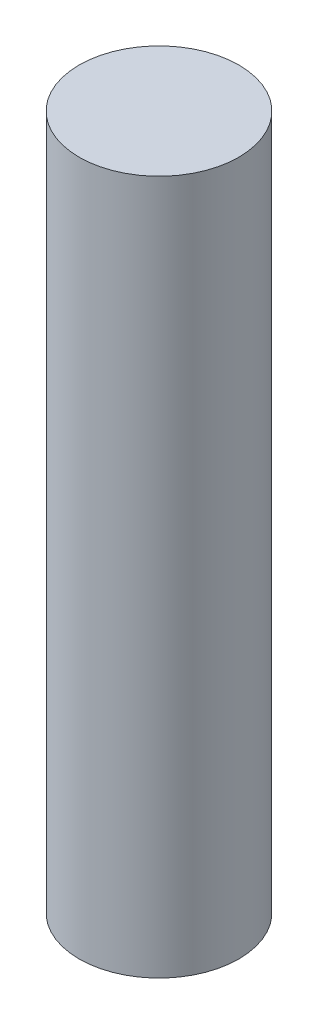
ISO-10303-21;
HEADER;
FILE_DESCRIPTION(('STEP AP214'),'2;1');
FILE_NAME('part.step','',(''),(''),'','','');
FILE_SCHEMA(('AUTOMOTIVE_DESIGN { 1 0 10303 214 1 1 1 1 }'));
ENDSEC;
DATA;
#1=APPLICATION_CONTEXT('core data for automotive mechanical design processes');
#2=APPLICATION_PROTOCOL_DEFINITION('international standard','automotive_design',2000,#1);
#3=PRODUCT_CONTEXT('',#1,'mechanical');
#4=PRODUCT('Part','Part','',(#3));
#5=PRODUCT_RELATED_PRODUCT_CATEGORY('part','',(#4));
#6=PRODUCT_DEFINITION_FORMATION('','',#4);
#7=PRODUCT_DEFINITION_CONTEXT('part definition',#1,'design');
#8=PRODUCT_DEFINITION('design','',#6,#7);
#9=PRODUCT_DEFINITION_SHAPE('','',#8);
#10=(LENGTH_UNIT() NAMED_UNIT(*) SI_UNIT(.MILLI.,.METRE.));
#11=(NAMED_UNIT(*) PLANE_ANGLE_UNIT() SI_UNIT($,.RADIAN.));
#12=(NAMED_UNIT(*) SI_UNIT($,.STERADIAN.) SOLID_ANGLE_UNIT());
#13=UNCERTAINTY_MEASURE_WITH_UNIT(LENGTH_MEASURE(1.E-05),#10,'distance_accuracy_value','');
#14=(GEOMETRIC_REPRESENTATION_CONTEXT(3) GLOBAL_UNCERTAINTY_ASSIGNED_CONTEXT((#13)) GLOBAL_UNIT_ASSIGNED_CONTEXT((#10,
#11,#12)) REPRESENTATION_CONTEXT('',''));
#15=CARTESIAN_POINT('',(0.,0.,0.));
#16=DIRECTION('',(0.,0.,1.));
#17=DIRECTION('',(1.,0.,0.));
#18=AXIS2_PLACEMENT_3D('',#15,#16,#17);
#19=CARTESIAN_POINT('',(0.,30.,0.));
#20=DIRECTION('',(0.,-1.,0.));
#21=DIRECTION('',(0.,0.,-1.));
#22=AXIS2_PLACEMENT_3D('',#19,#20,#21);
#23=CYLINDRICAL_SURFACE('',#22,3.45);
#24=CARTESIAN_POINT('',(0.,30.,0.));
#25=DIRECTION('',(0.,1.,0.));
#26=DIRECTION('',(0.,0.,1.));
#27=AXIS2_PLACEMENT_3D('',#24,#25,#26);
#28=CIRCLE('',#27,3.45);
#29=CARTESIAN_POINT('',(0.,30.,3.45));
#30=VERTEX_POINT('',#29);
#31=EDGE_CURVE('E10',#30,#30,#28,.T.);
#32=ORIENTED_EDGE('',*,*,#31,.F.);
#33=EDGE_LOOP('',(#32));
#34=FACE_BOUND('',#33,.T.);
#35=CARTESIAN_POINT('',(0.,0.,0.));
#36=DIRECTION('',(0.,1.,0.));
#37=DIRECTION('',(0.,0.,1.));
#38=AXIS2_PLACEMENT_3D('',#35,#36,#37);
#39=CIRCLE('',#38,3.45);
#40=CARTESIAN_POINT('',(0.,0.,3.45));
#41=VERTEX_POINT('',#40);
#42=EDGE_CURVE('E34',#41,#41,#39,.T.);
#43=ORIENTED_EDGE('',*,*,#42,.T.);
#44=EDGE_LOOP('',(#43));
#45=FACE_BOUND('',#44,.T.);
#46=ADVANCED_FACE('F31',(#34,#45),#23,.T.);
#47=CARTESIAN_POINT('',(0.,30.,0.));
#48=DIRECTION('',(0.,1.,0.));
#49=DIRECTION('',(0.,0.,1.));
#50=AXIS2_PLACEMENT_3D('',#47,#48,#49);
#51=PLANE('',#50);
#52=ORIENTED_EDGE('',*,*,#31,.T.);
#53=EDGE_LOOP('',(#52));
#54=FACE_BOUND('',#53,.T.);
#55=ADVANCED_FACE('F46',(#54),#51,.T.);
#56=CARTESIAN_POINT('',(0.,0.,0.));
#57=DIRECTION('',(0.,1.,0.));
#58=DIRECTION('',(0.,0.,1.));
#59=AXIS2_PLACEMENT_3D('',#56,#57,#58);
#60=PLANE('',#59);
#61=ORIENTED_EDGE('',*,*,#42,.F.);
#62=EDGE_LOOP('',(#61));
#63=FACE_BOUND('',#62,.T.);
#64=ADVANCED_FACE('F44',(#63),#60,.F.);
#65=CLOSED_SHELL('',(#46,#55,#64));
#66=MANIFOLD_SOLID_BREP('B2',#65);
#67=ADVANCED_BREP_SHAPE_REPRESENTATION('',(#18,#66),#14);
#68=SHAPE_DEFINITION_REPRESENTATION(#9,#67);
ENDSEC;
END-ISO-10303-21;
